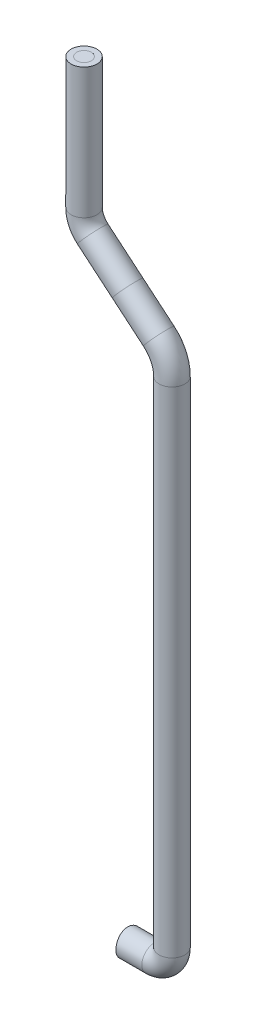
ISO-10303-21;
HEADER;
FILE_DESCRIPTION(('STEP AP214'),'2;1');
FILE_NAME('part.step','',(''),(''),'','','');
FILE_SCHEMA(('AUTOMOTIVE_DESIGN { 1 0 10303 214 1 1 1 1 }'));
ENDSEC;
DATA;
#1=APPLICATION_CONTEXT('core data for automotive mechanical design processes');
#2=APPLICATION_PROTOCOL_DEFINITION('international standard','automotive_design',2000,#1);
#3=PRODUCT_CONTEXT('',#1,'mechanical');
#4=PRODUCT('Part','Part','',(#3));
#5=PRODUCT_RELATED_PRODUCT_CATEGORY('part','',(#4));
#6=PRODUCT_DEFINITION_FORMATION('','',#4);
#7=PRODUCT_DEFINITION_CONTEXT('part definition',#1,'design');
#8=PRODUCT_DEFINITION('design','',#6,#7);
#9=PRODUCT_DEFINITION_SHAPE('','',#8);
#10=(LENGTH_UNIT() NAMED_UNIT(*) SI_UNIT(.MILLI.,.METRE.));
#11=(NAMED_UNIT(*) PLANE_ANGLE_UNIT() SI_UNIT($,.RADIAN.));
#12=(NAMED_UNIT(*) SI_UNIT($,.STERADIAN.) SOLID_ANGLE_UNIT());
#13=UNCERTAINTY_MEASURE_WITH_UNIT(LENGTH_MEASURE(1.E-05),#10,'distance_accuracy_value','');
#14=(GEOMETRIC_REPRESENTATION_CONTEXT(3) GLOBAL_UNCERTAINTY_ASSIGNED_CONTEXT((#13)) GLOBAL_UNIT_ASSIGNED_CONTEXT((#10,
#11,#12)) REPRESENTATION_CONTEXT('',''));
#15=CARTESIAN_POINT('',(0.,0.,0.));
#16=DIRECTION('',(0.,0.,1.));
#17=DIRECTION('',(1.,0.,0.));
#18=AXIS2_PLACEMENT_3D('',#15,#16,#17);
#19=CARTESIAN_POINT('',(-1.4,-1.4,0.));
#20=DIRECTION('',(-1.,0.,0.));
#21=DIRECTION('',(0.,0.,1.));
#22=AXIS2_PLACEMENT_3D('',#19,#20,#21);
#23=CYLINDRICAL_SURFACE('',#22,0.6);
#24=CARTESIAN_POINT('',(-1.4,-1.4,0.));
#25=DIRECTION('',(-1.,0.,0.));
#26=DIRECTION('',(0.,0.,-1.));
#27=AXIS2_PLACEMENT_3D('',#24,#25,#26);
#28=CIRCLE('',#27,0.6);
#29=CARTESIAN_POINT('',(-1.4,-2.,0.));
#30=VERTEX_POINT('',#29);
#31=EDGE_CURVE('E80',#30,#30,#28,.T.);
#32=ORIENTED_EDGE('',*,*,#31,.T.);
#33=EDGE_LOOP('',(#32));
#34=FACE_BOUND('',#33,.T.);
#35=CARTESIAN_POINT('',(-3.6,-2.,0.));
#36=CARTESIAN_POINT('',(-3.59999938603146,-1.99999729292333,-0.0335918457265137));
#37=CARTESIAN_POINT('',(-3.59971478377764,-1.99716856482653,-0.0672119542969745));
#38=CARTESIAN_POINT('',(-3.59860568944523,-1.98591814856572,-0.133551192087413));
#39=CARTESIAN_POINT('',(-3.59778006290974,-1.97748470752623,-0.1662682772259));
#40=CARTESIAN_POINT('',(-3.59568234677437,-1.95527324265569,-0.229786553121766));
#41=CARTESIAN_POINT('',(-3.59441069727381,-1.94150048582344,-0.260589597359059));
#42=CARTESIAN_POINT('',(-3.59156337422976,-1.90901102950739,-0.319432433360506));
#43=CARTESIAN_POINT('',(-3.58998783342366,-1.89029648724535,-0.347473423519698));
#44=CARTESIAN_POINT('',(-3.58670250528,-1.84837889093529,-0.400115063589076));
#45=CARTESIAN_POINT('',(-3.58499229287426,-1.82516125636204,-0.424704078066687));
#46=CARTESIAN_POINT('',(-3.58163382240315,-1.7749266019936,-0.4696445222726));
#47=CARTESIAN_POINT('',(-3.57998557023974,-1.74790922141375,-0.489995549149648));
#48=CARTESIAN_POINT('',(-3.57693354248889,-1.69077275458397,-0.525920460322328));
#49=CARTESIAN_POINT('',(-3.57553028796241,-1.66064726924697,-0.5414842153007));
#50=CARTESIAN_POINT('',(-3.57313221656801,-1.59819436570304,-0.567327921195507));
#51=CARTESIAN_POINT('',(-3.57213738604487,-1.56586702115494,-0.577608048767019));
#52=CARTESIAN_POINT('',(-3.57067250509072,-1.50004294873963,-0.59255941823305));
#53=CARTESIAN_POINT('',(-3.57020070322109,-1.46655051338077,-0.597249383602786));
#54=CARTESIAN_POINT('',(-3.56982985819532,-1.39925074185212,-0.600945172724531));
#55=CARTESIAN_POINT('',(-3.56993080099697,-1.36544341342298,-0.599951135833545));
#56=CARTESIAN_POINT('',(-3.57069243966251,-1.29860296605112,-0.592322585938024));
#57=CARTESIAN_POINT('',(-3.57135110155444,-1.26556748150734,-0.585708568398926));
#58=CARTESIAN_POINT('',(-3.57315079526416,-1.2010775098771,-0.567059594864203));
#59=CARTESIAN_POINT('',(-3.57429183798723,-1.16962305855133,-0.555024516313275));
#60=CARTESIAN_POINT('',(-3.5769301115438,-1.10912259469532,-0.525851938170345));
#61=CARTESIAN_POINT('',(-3.57842798827888,-1.08008107988233,-0.50870517164905));
#62=CARTESIAN_POINT('',(-3.58161044950285,-1.02528273385679,-0.46980418892808));
#63=CARTESIAN_POINT('',(-3.58329502402661,-0.999525727489062,-0.448050218584593));
#64=CARTESIAN_POINT('',(-3.58666992352064,-0.951910269980742,-0.400442064223918));
#65=CARTESIAN_POINT('',(-3.58836024277563,-0.930068720962396,-0.37457097277022));
#66=CARTESIAN_POINT('',(-3.59155027126064,-0.89102580573899,-0.319506886235193));
#67=CARTESIAN_POINT('',(-3.59304989199853,-0.873826589645823,-0.290312360763655));
#68=CARTESIAN_POINT('',(-3.59569027405106,-0.844558520129377,-0.229407979063295));
#69=CARTESIAN_POINT('',(-3.59683067670068,-0.832494790089495,-0.197695648201072));
#70=CARTESIAN_POINT('',(-3.59861914853772,-0.813895006647917,-0.132733635856683));
#71=CARTESIAN_POINT('',(-3.5992682616839,-0.807347228832552,-0.0994873743933924));
#72=CARTESIAN_POINT('',(-3.59987862644742,-0.801212274817143,-0.0440546787228878));
#73=CARTESIAN_POINT('',(-3.60000040271161,-0.799998224385904,-0.0220334190582218));
#74=CARTESIAN_POINT('',(-3.59999938603146,-0.800002707076674,0.0335918457265163));
#75=CARTESIAN_POINT('',(-3.59971478377764,-0.80283143517347,0.067211954296977));
#76=CARTESIAN_POINT('',(-3.59860568944523,-0.814081851434279,0.133551192087416));
#77=CARTESIAN_POINT('',(-3.59778006290974,-0.822515292473775,0.166268277225903));
#78=CARTESIAN_POINT('',(-3.59568234677437,-0.844726757344313,0.229786553121768));
#79=CARTESIAN_POINT('',(-3.59441069727381,-0.85849951417656,0.260589597359061));
#80=CARTESIAN_POINT('',(-3.59156337422976,-0.890988970492611,0.319432433360508));
#81=CARTESIAN_POINT('',(-3.58998783342366,-0.909703512754648,0.3474734235197));
#82=CARTESIAN_POINT('',(-3.58670250528,-0.951621109064715,0.400115063589078));
#83=CARTESIAN_POINT('',(-3.58499229287426,-0.97483874363796,0.424704078066689));
#84=CARTESIAN_POINT('',(-3.58163382240315,-1.02507339800641,0.469644522272602));
#85=CARTESIAN_POINT('',(-3.57998557023974,-1.05209077858625,0.489995549149649));
#86=CARTESIAN_POINT('',(-3.57693354248889,-1.10922724541604,0.52592046032233));
#87=CARTESIAN_POINT('',(-3.57553028796241,-1.13935273075303,0.541484215300701));
#88=CARTESIAN_POINT('',(-3.57313221656801,-1.20180563429697,0.567327921195508));
#89=CARTESIAN_POINT('',(-3.57213738604487,-1.23413297884507,0.57760804876702));
#90=CARTESIAN_POINT('',(-3.57067250509072,-1.29995705126037,0.592559418233051));
#91=CARTESIAN_POINT('',(-3.57020070322109,-1.33344948661923,0.597249383602787));
#92=CARTESIAN_POINT('',(-3.56982985819532,-1.40074925814788,0.600945172724531));
#93=CARTESIAN_POINT('',(-3.56993080099697,-1.43455658657702,0.599951135833545));
#94=CARTESIAN_POINT('',(-3.57069243966251,-1.50139703394888,0.592322585938023));
#95=CARTESIAN_POINT('',(-3.57135110155444,-1.53443251849266,0.585708568398925));
#96=CARTESIAN_POINT('',(-3.57315079526416,-1.5989224901229,0.567059594864202));
#97=CARTESIAN_POINT('',(-3.57429183798723,-1.63037694144867,0.555024516313274));
#98=CARTESIAN_POINT('',(-3.5769301115438,-1.69087740530468,0.525851938170343));
#99=CARTESIAN_POINT('',(-3.57842798827888,-1.71991892011767,0.508705171649048));
#100=CARTESIAN_POINT('',(-3.58161044950285,-1.77471726614321,0.469804188928079));
#101=CARTESIAN_POINT('',(-3.58329502402661,-1.80047427251094,0.448050218584592));
#102=CARTESIAN_POINT('',(-3.58666992352064,-1.84808973001926,0.400442064223916));
#103=CARTESIAN_POINT('',(-3.58836024277563,-1.86993127903761,0.374570972770218));
#104=CARTESIAN_POINT('',(-3.59155027126064,-1.90897419426101,0.31950688623519));
#105=CARTESIAN_POINT('',(-3.59304989199853,-1.92617341035418,0.290312360763652));
#106=CARTESIAN_POINT('',(-3.59569027405106,-1.95544147987062,0.229407979063292));
#107=CARTESIAN_POINT('',(-3.59683067670068,-1.96750520991051,0.197695648201069));
#108=CARTESIAN_POINT('',(-3.59861914853772,-1.98610499335208,0.13273363585668));
#109=CARTESIAN_POINT('',(-3.5992682616839,-1.99265277116745,0.0994873743933895));
#110=CARTESIAN_POINT('',(-3.59987862644742,-1.99878772518286,0.0440546787228867));
#111=CARTESIAN_POINT('',(-3.60000040271161,-2.0000017756141,0.0220334190582226));
#112=CARTESIAN_POINT('',(-3.6,-2.,0.));
#113=B_SPLINE_CURVE_WITH_KNOTS('',3,(#35,#36,#37,#38,#39,#40,#41,#42,#43,#44,#45,#46,#47,#48,
#49,#50,#51,#52,#53,#54,#55,#56,#57,#58,#59,#60,#61,#62,#63,#64,#65,#66,#67,#68,#69,#70,#71,#72,
#73,#74,#75,#76,#77,#78,#79,#80,#81,#82,#83,#84,#85,#86,#87,#88,#89,#90,#91,#92,#93,#94,#95,#96,
#97,#98,#99,#100,#101,#102,#103,#104,#105,#106,#107,#108,#109,#110,#111,#112),.UNSPECIFIED.,.T.,
.F.,(4,2,2,2,2,2,2,2,2,2,2,2,2,2,2,2,2,2,2,2,2,2,2,2,2,2,2,2,2,2,2,2,2,2,2,2,2,2,4),(0.,
0.100705430393277,0.201622705491087,0.302440682440186,0.403214722186349,0.504320675336556,
0.605436234953383,0.706764294654636,0.808088966289427,0.909073302660921,1.01005516316879,
1.11067032651546,1.21128776460886,1.31208873196716,1.4128843215951,1.5141050611402,
1.61537260127478,1.7167409348648,1.81789325775417,1.88394753078694,1.98465296118021,
2.08557023627802,2.18638821322712,2.28716225297329,2.38826820612349,2.48938376574032,
2.59071182544157,2.69203649707636,2.79302083344786,2.89400269395573,2.9946178573024,
3.09523529539579,3.1960362627541,3.29683185238204,3.39805259192713,3.49932013206172,
3.60068846565173,3.70184078854111,3.76789506157387),.UNSPECIFIED.);
#114=CARTESIAN_POINT('',(-3.6,-2.,0.));
#115=VERTEX_POINT('',#114);
#116=EDGE_CURVE('E11',#115,#115,#113,.T.);
#117=ORIENTED_EDGE('',*,*,#116,.T.);
#118=EDGE_LOOP('',(#117));
#119=FACE_BOUND('',#118,.T.);
#120=ADVANCED_FACE('F43',(#34,#119),#23,.T.);
#121=CARTESIAN_POINT('',(-7.15,59.1195496892275,0.));
#122=DIRECTION('',(0.,-1.,0.));
#123=DIRECTION('',(0.,0.,-1.));
#124=AXIS2_PLACEMENT_3D('',#121,#122,#123);
#125=PLANE('',#124);
#126=CARTESIAN_POINT('',(-7.15,59.1195496892275,0.));
#127=DIRECTION('',(0.,-1.,0.));
#128=DIRECTION('',(0.,0.,-1.));
#129=AXIS2_PLACEMENT_3D('',#126,#127,#128);
#130=CIRCLE('',#129,0.6);
#131=CARTESIAN_POINT('',(-7.15,59.1195496892275,-0.6));
#132=VERTEX_POINT('',#131);
#133=EDGE_CURVE('E55',#132,#132,#130,.T.);
#134=ORIENTED_EDGE('',*,*,#133,.F.);
#135=EDGE_LOOP('',(#134));
#136=FACE_BOUND('',#135,.T.);
#137=ADVANCED_FACE('F45',(#136),#125,.F.);
#138=CARTESIAN_POINT('',(0.,0.,0.));
#139=DIRECTION('',(0.,1.,0.));
#140=DIRECTION('',(0.,0.,1.));
#141=AXIS2_PLACEMENT_3D('',#138,#139,#140);
#142=CYLINDRICAL_SURFACE('',#141,0.6);
#143=CARTESIAN_POINT('',(0.,40.180318355535,0.));
#144=DIRECTION('',(0.,-1.,0.));
#145=DIRECTION('',(0.,0.,-1.));
#146=AXIS2_PLACEMENT_3D('',#143,#144,#145);
#147=CIRCLE('',#146,0.6);
#148=CARTESIAN_POINT('',(0.6,40.180318355535,0.));
#149=VERTEX_POINT('',#148);
#150=EDGE_CURVE('E74',#149,#149,#147,.T.);
#151=ORIENTED_EDGE('',*,*,#150,.T.);
#152=EDGE_LOOP('',(#151));
#153=FACE_BOUND('',#152,.T.);
#154=CARTESIAN_POINT('',(0.,0.,0.));
#155=DIRECTION('',(0.,-1.,0.));
#156=DIRECTION('',(0.,0.,-1.));
#157=AXIS2_PLACEMENT_3D('',#154,#155,#156);
#158=CIRCLE('',#157,0.6);
#159=CARTESIAN_POINT('',(0.600000000000001,0.,0.));
#160=VERTEX_POINT('',#159);
#161=EDGE_CURVE('E77',#160,#160,#158,.T.);
#162=ORIENTED_EDGE('',*,*,#161,.F.);
#163=EDGE_LOOP('',(#162));
#164=FACE_BOUND('',#163,.T.);
#165=ADVANCED_FACE('F93',(#153,#164),#142,.T.);
#166=CARTESIAN_POINT('',(-3.,40.180318355535,0.));
#167=DIRECTION('',(0.,0.,1.));
#168=DIRECTION('',(1.,0.,0.));
#169=AXIS2_PLACEMENT_3D('',#166,#167,#168);
#170=TOROIDAL_SURFACE('',#169,3.,0.6);
#171=CARTESIAN_POINT('',(-1.07163717094039,42.4784516848919,0.));
#172=DIRECTION('',(0.766044443118979,-0.642787609686538,0.));
#173=DIRECTION('',(0.,0.,-1.));
#174=AXIS2_PLACEMENT_3D('',#171,#172,#173);
#175=CIRCLE('',#174,0.6);
#176=CARTESIAN_POINT('',(-0.685964605128464,42.9380783507633,0.));
#177=VERTEX_POINT('',#176);
#178=EDGE_CURVE('E71',#177,#177,#175,.T.);
#179=CARTESIAN_POINT('',(-3.,40.180318355535,0.));
#180=DIRECTION('',(0.,0.,1.));
#181=DIRECTION('',(1.,0.,0.));
#182=AXIS2_PLACEMENT_3D('',#179,#180,#181);
#183=CIRCLE('',#182,3.6);
#184=EDGE_CURVE('',#149,#177,#183,.T.);
#185=ORIENTED_EDGE('',*,*,#150,.F.);
#186=ORIENTED_EDGE('',*,*,#178,.T.);
#187=ORIENTED_EDGE('',*,*,#184,.T.);
#188=ORIENTED_EDGE('',*,*,#184,.F.);
#189=EDGE_LOOP('',(#185,#187,#186,#188));
#190=FACE_BOUND('',#189,.T.);
#191=ADVANCED_FACE('F95',(#190),#170,.T.);
#192=CARTESIAN_POINT('',(-1.07163717094039,42.4784516848919,0.));
#193=DIRECTION('',(-0.76604444311898,0.642787609686537,0.));
#194=DIRECTION('',(-0.642787609686537,-0.76604444311898,0.));
#195=AXIS2_PLACEMENT_3D('',#192,#193,#194);
#196=CYLINDRICAL_SURFACE('',#195,0.6);
#197=CARTESIAN_POINT('',(-3.6,44.6000000022382,0.));
#198=DIRECTION('',(0.76604444311898,-0.642787609686537,0.));
#199=DIRECTION('',(0.,0.,-1.));
#200=AXIS2_PLACEMENT_3D('',#197,#198,#199);
#201=CIRCLE('',#200,0.6);
#202=CARTESIAN_POINT('',(-3.6,44.6000000022382,-0.6));
#203=VERTEX_POINT('',#202);
#204=EDGE_CURVE('E68',#203,#203,#201,.T.);
#205=ORIENTED_EDGE('',*,*,#204,.T.);
#206=EDGE_LOOP('',(#205));
#207=FACE_BOUND('',#206,.T.);
#208=ORIENTED_EDGE('',*,*,#178,.F.);
#209=EDGE_LOOP('',(#208));
#210=FACE_BOUND('',#209,.T.);
#211=ADVANCED_FACE('F102',(#207,#210),#196,.T.);
#212=CARTESIAN_POINT('',(-3.6,44.6000000022382,0.));
#213=DIRECTION('',(-0.766044443118978,0.64278760968654,0.));
#214=DIRECTION('',(-0.64278760968654,-0.766044443118978,0.));
#215=AXIS2_PLACEMENT_3D('',#212,#213,#214);
#216=CYLINDRICAL_SURFACE('',#215,0.6);
#217=CARTESIAN_POINT('',(-6.43557521937307,46.9793301229896,0.));
#218=DIRECTION('',(0.766044443118978,-0.642787609686539,0.));
#219=DIRECTION('',(0.,0.,-1.));
#220=AXIS2_PLACEMENT_3D('',#217,#218,#219);
#221=CIRCLE('',#220,0.6);
#222=CARTESIAN_POINT('',(-6.82124778518499,46.5197034571182,0.));
#223=VERTEX_POINT('',#222);
#224=EDGE_CURVE('E63',#223,#223,#221,.T.);
#225=ORIENTED_EDGE('',*,*,#224,.T.);
#226=EDGE_LOOP('',(#225));
#227=FACE_BOUND('',#226,.T.);
#228=ORIENTED_EDGE('',*,*,#204,.F.);
#229=EDGE_LOOP('',(#228));
#230=FACE_BOUND('',#229,.T.);
#231=ADVANCED_FACE('F115',(#227,#230),#216,.T.);
#232=CARTESIAN_POINT('',(-5.15,48.5114190092275,0.));
#233=DIRECTION('',(0.,0.,-1.));
#234=DIRECTION('',(-1.,0.,0.));
#235=AXIS2_PLACEMENT_3D('',#232,#233,#234);
#236=TOROIDAL_SURFACE('',#235,1.99999999999999,0.6);
#237=CARTESIAN_POINT('',(-7.15,48.5114190092275,0.));
#238=DIRECTION('',(0.,-1.,0.));
#239=DIRECTION('',(0.,0.,-1.));
#240=AXIS2_PLACEMENT_3D('',#237,#238,#239);
#241=CIRCLE('',#240,0.6);
#242=CARTESIAN_POINT('',(-7.74999999999999,48.5114190092275,0.));
#243=VERTEX_POINT('',#242);
#244=EDGE_CURVE('E59',#243,#243,#241,.T.);
#245=CARTESIAN_POINT('',(-5.15,48.5114190092275,0.));
#246=DIRECTION('',(0.,0.,-1.));
#247=DIRECTION('',(-1.,0.,0.));
#248=AXIS2_PLACEMENT_3D('',#245,#246,#247);
#249=CIRCLE('',#248,2.59999999999999);
#250=EDGE_CURVE('',#223,#243,#249,.T.);
#251=ORIENTED_EDGE('',*,*,#224,.F.);
#252=ORIENTED_EDGE('',*,*,#244,.T.);
#253=ORIENTED_EDGE('',*,*,#250,.T.);
#254=ORIENTED_EDGE('',*,*,#250,.F.);
#255=EDGE_LOOP('',(#251,#253,#252,#254));
#256=FACE_BOUND('',#255,.T.);
#257=ADVANCED_FACE('F111',(#256),#236,.T.);
#258=CARTESIAN_POINT('',(-7.15,48.5114190092275,0.));
#259=DIRECTION('',(0.,1.,0.));
#260=DIRECTION('',(-1.,0.,0.));
#261=AXIS2_PLACEMENT_3D('',#258,#259,#260);
#262=CYLINDRICAL_SURFACE('',#261,0.6);
#263=ORIENTED_EDGE('',*,*,#133,.T.);
#264=EDGE_LOOP('',(#263));
#265=FACE_BOUND('',#264,.T.);
#266=ORIENTED_EDGE('',*,*,#244,.F.);
#267=EDGE_LOOP('',(#266));
#268=FACE_BOUND('',#267,.T.);
#269=ADVANCED_FACE('F89',(#265,#268),#262,.T.);
#270=CARTESIAN_POINT('',(-1.4,0.,0.));
#271=DIRECTION('',(0.,0.,-1.));
#272=DIRECTION('',(-1.,0.,0.));
#273=AXIS2_PLACEMENT_3D('',#270,#271,#272);
#274=TOROIDAL_SURFACE('',#273,1.4,0.6);
#275=CARTESIAN_POINT('',(-1.4,0.,0.));
#276=DIRECTION('',(0.,0.,-1.));
#277=DIRECTION('',(-1.,0.,0.));
#278=AXIS2_PLACEMENT_3D('',#275,#276,#277);
#279=CIRCLE('',#278,2.);
#280=EDGE_CURVE('',#160,#30,#279,.T.);
#281=ORIENTED_EDGE('',*,*,#161,.T.);
#282=ORIENTED_EDGE('',*,*,#31,.F.);
#283=ORIENTED_EDGE('',*,*,#280,.T.);
#284=ORIENTED_EDGE('',*,*,#280,.F.);
#285=EDGE_LOOP('',(#281,#283,#282,#284));
#286=FACE_BOUND('',#285,.T.);
#287=ADVANCED_FACE('F85',(#286),#274,.T.);
#288=CARTESIAN_POINT('',(2.4,7.55,0.));
#289=DIRECTION('',(0.,-1.,0.));
#290=DIRECTION('',(0.,0.,-1.));
#291=AXIS2_PLACEMENT_3D('',#288,#289,#290);
#292=CYLINDRICAL_SURFACE('',#291,6.);
#293=ORIENTED_EDGE('',*,*,#116,.F.);
#294=EDGE_LOOP('',(#293));
#295=FACE_BOUND('',#294,.T.);
#296=ADVANCED_FACE('F88',(#295),#292,.T.);
#297=CLOSED_SHELL('',(#120,#137,#165,#191,#211,#231,#257,#269,#287,#296));
#298=MANIFOLD_SOLID_BREP('B2',#297);
#299=CARTESIAN_POINT('',(-1.4,-1.4,0.));
#300=DIRECTION('',(-1.,0.,0.));
#301=DIRECTION('',(0.,0.,1.));
#302=AXIS2_PLACEMENT_3D('',#299,#300,#301);
#303=CYLINDRICAL_SURFACE('',#302,1.05);
#304=CARTESIAN_POINT('',(-1.4,-1.4,0.));
#305=DIRECTION('',(-1.,0.,0.));
#306=DIRECTION('',(0.,0.,-1.));
#307=AXIS2_PLACEMENT_3D('',#304,#305,#306);
#308=CIRCLE('',#307,1.05);
#309=CARTESIAN_POINT('',(-1.4,-2.45,0.));
#310=VERTEX_POINT('',#309);
#311=EDGE_CURVE('E253',#310,#310,#308,.T.);
#312=ORIENTED_EDGE('',*,*,#311,.T.);
#313=EDGE_LOOP('',(#312));
#314=FACE_BOUND('',#313,.T.);
#315=CARTESIAN_POINT('',(-3.6,-2.45,0.));
#316=CARTESIAN_POINT('',(-3.59999882654764,-2.44999728144867,-0.0584420204428061));
#317=CARTESIAN_POINT('',(-3.59913650732618,-2.44510000910616,-0.116958132425665));
#318=CARTESIAN_POINT('',(-3.59577722267333,-2.42563787265427,-0.232390779304183));
#319=CARTESIAN_POINT('',(-3.59327695859125,-2.41105349890432,-0.289303844077928));
#320=CARTESIAN_POINT('',(-3.58692199180402,-2.372672010416,-0.39977751157926));
#321=CARTESIAN_POINT('',(-3.58306903010429,-2.34888673381991,-0.453342319817157));
#322=CARTESIAN_POINT('',(-3.57443219380795,-2.29280692209552,-0.555699045634291));
#323=CARTESIAN_POINT('',(-3.5696486570959,-2.26051547398982,-0.604492685953901));
#324=CARTESIAN_POINT('',(-3.55962263242419,-2.18797278745103,-0.696463405273728));
#325=CARTESIAN_POINT('',(-3.55437621501589,-2.14764882283901,-0.739582703296022));
#326=CARTESIAN_POINT('',(-3.54404526339027,-2.06034040782813,-0.818482226810394));
#327=CARTESIAN_POINT('',(-3.53896074840682,-2.01335516966361,-0.854261583050793));
#328=CARTESIAN_POINT('',(-3.52949202998072,-1.91366364465653,-0.917694608774674));
#329=CARTESIAN_POINT('',(-3.52511282919395,-1.86092059142462,-0.945291308382155));
#330=CARTESIAN_POINT('',(-3.51760474008986,-1.75145827462108,-0.991210841917993));
#331=CARTESIAN_POINT('',(-3.51447574761267,-1.69473934275885,-1.0095344484589));
#332=CARTESIAN_POINT('',(-3.50986115542547,-1.57954282817136,-1.03620668485384));
#333=CARTESIAN_POINT('',(-3.5083592501825,-1.52108884235882,-1.04465435357991));
#334=CARTESIAN_POINT('',(-3.50711962872806,-1.40357521569552,-1.05164211226404));
#335=CARTESIAN_POINT('',(-3.50738177772354,-1.34451562146419,-1.05018295921163));
#336=CARTESIAN_POINT('',(-3.50962576963407,-1.22817892307428,-1.03747905088222));
#337=CARTESIAN_POINT('',(-3.51158795307566,-1.17088916864427,-1.02634615998595));
#338=CARTESIAN_POINT('',(-3.51698013671817,-1.05900290273248,-0.994786430854397));
#339=CARTESIAN_POINT('',(-3.5204102037736,-1.00440651404589,-0.974359169305901));
#340=CARTESIAN_POINT('',(-3.528372773444,-0.899123656399449,-0.924677939988589));
#341=CARTESIAN_POINT('',(-3.53291102606906,-0.848459458162703,-0.895377736596717));
#342=CARTESIAN_POINT('',(-3.54257425888112,-0.752728317622276,-0.828817510782036));
#343=CARTESIAN_POINT('',(-3.54769924636775,-0.707661444970163,-0.791557389323903));
#344=CARTESIAN_POINT('',(-3.55804394565978,-0.623760548003456,-0.709535297831806));
#345=CARTESIAN_POINT('',(-3.56326400197189,-0.585018921961037,-0.66467880741791));
#346=CARTESIAN_POINT('',(-3.57314929955695,-0.51558044588738,-0.569030028255325));
#347=CARTESIAN_POINT('',(-3.57781429323867,-0.484887178613202,-0.518235110491179));
#348=CARTESIAN_POINT('',(-3.58607198078178,-0.432408705294869,-0.412047228325481));
#349=CARTESIAN_POINT('',(-3.58966274845476,-0.410639475324484,-0.356646229329764));
#350=CARTESIAN_POINT('',(-3.59534708225393,-0.376784906318021,-0.242969833236208));
#351=CARTESIAN_POINT('',(-3.59744380052951,-0.364679172679017,-0.184700766731596));
#352=CARTESIAN_POINT('',(-3.5991178906655,-0.355050834919473,-0.105003930626633));
#353=CARTESIAN_POINT('',(-3.59944796804276,-0.353158320413336,-0.0840519549830512));
#354=CARTESIAN_POINT('',(-3.59988923404206,-0.35063241299874,-0.0420698538801488));
#355=CARTESIAN_POINT('',(-3.60000042245492,-0.349999021293564,-0.0210397283461636));
#356=CARTESIAN_POINT('',(-3.59999882654764,-0.350002718551328,0.0584420204428084));
#357=CARTESIAN_POINT('',(-3.59913650732618,-0.354899990893835,0.116958132425667));
#358=CARTESIAN_POINT('',(-3.59577722267333,-0.374362127345728,0.232390779304185));
#359=CARTESIAN_POINT('',(-3.59327695859125,-0.388946501095684,0.28930384407793));
#360=CARTESIAN_POINT('',(-3.58692199180402,-0.427327989583997,0.399777511579263));
#361=CARTESIAN_POINT('',(-3.58306903010429,-0.451113266180095,0.45334231981716));
#362=CARTESIAN_POINT('',(-3.57443219380795,-0.50719307790448,0.555699045634293));
#363=CARTESIAN_POINT('',(-3.5696486570959,-0.53948452601018,0.604492685953903));
#364=CARTESIAN_POINT('',(-3.55962263242419,-0.612027212548971,0.69646340527373));
#365=CARTESIAN_POINT('',(-3.5543762150159,-0.652351177160994,0.739582703296024));
#366=CARTESIAN_POINT('',(-3.54404526339027,-0.739659592171875,0.818482226810397));
#367=CARTESIAN_POINT('',(-3.53896074840682,-0.786644830336395,0.854261583050795));
#368=CARTESIAN_POINT('',(-3.52949202998072,-0.886336355343475,0.917694608774675));
#369=CARTESIAN_POINT('',(-3.52511282919395,-0.93907940857538,0.945291308382156));
#370=CARTESIAN_POINT('',(-3.51760474008987,-1.04854172537893,0.991210841917993));
#371=CARTESIAN_POINT('',(-3.51447574761267,-1.10526065724115,1.0095344484589));
#372=CARTESIAN_POINT('',(-3.50986115542547,-1.22045717182864,1.03620668485384));
#373=CARTESIAN_POINT('',(-3.5083592501825,-1.27891115764118,1.04465435357991));
#374=CARTESIAN_POINT('',(-3.50711962872806,-1.39642478430449,1.05164211226404));
#375=CARTESIAN_POINT('',(-3.50738177772354,-1.45548437853582,1.05018295921163));
#376=CARTESIAN_POINT('',(-3.50962576963407,-1.57182107692573,1.03747905088222));
#377=CARTESIAN_POINT('',(-3.51158795307566,-1.62911083135573,1.02634615998595));
#378=CARTESIAN_POINT('',(-3.51698013671817,-1.74099709726753,0.994786430854397));
#379=CARTESIAN_POINT('',(-3.5204102037736,-1.79559348595411,0.9743591693059));
#380=CARTESIAN_POINT('',(-3.528372773444,-1.90087634360055,0.924677939988588));
#381=CARTESIAN_POINT('',(-3.53291102606906,-1.9515405418373,0.895377736596715));
#382=CARTESIAN_POINT('',(-3.54257425888112,-2.04727168237773,0.828817510782034));
#383=CARTESIAN_POINT('',(-3.54769924636775,-2.09233855502984,0.791557389323901));
#384=CARTESIAN_POINT('',(-3.55804394565978,-2.17623945199655,0.709535297831804));
#385=CARTESIAN_POINT('',(-3.56326400197189,-2.21498107803897,0.664678807417908));
#386=CARTESIAN_POINT('',(-3.57314929955695,-2.28441955411262,0.569030028255322));
#387=CARTESIAN_POINT('',(-3.57781429323867,-2.3151128213868,0.518235110491175));
#388=CARTESIAN_POINT('',(-3.58607198078178,-2.36759129470513,0.412047228325477));
#389=CARTESIAN_POINT('',(-3.58966274845476,-2.38936052467552,0.35664622932976));
#390=CARTESIAN_POINT('',(-3.59534708225394,-2.42321509368198,0.242969833236204));
#391=CARTESIAN_POINT('',(-3.59744380052951,-2.43532082732098,0.184700766731593));
#392=CARTESIAN_POINT('',(-3.5991178906655,-2.44494916508053,0.105003930626631));
#393=CARTESIAN_POINT('',(-3.59944796804276,-2.44684167958666,0.0840519549830497));
#394=CARTESIAN_POINT('',(-3.59988923404206,-2.44936758700126,0.0420698538801492));
#395=CARTESIAN_POINT('',(-3.60000042245492,-2.45000097870644,0.0210397283461651));
#396=CARTESIAN_POINT('',(-3.6,-2.45,0.));
#397=B_SPLINE_CURVE_WITH_KNOTS('',3,(#315,#316,#317,#318,#319,#320,#321,#322,#323,#324,#325,
#326,#327,#328,#329,#330,#331,#332,#333,#334,#335,#336,#337,#338,#339,#340,#341,#342,#343,#344,
#345,#346,#347,#348,#349,#350,#351,#352,#353,#354,#355,#356,#357,#358,#359,#360,#361,#362,#363,
#364,#365,#366,#367,#368,#369,#370,#371,#372,#373,#374,#375,#376,#377,#378,#379,#380,#381,#382,
#383,#384,#385,#386,#387,#388,#389,#390,#391,#392,#393,#394,#395,#396),.UNSPECIFIED.,.T.,.F.,(4,
2,2,2,2,2,2,2,2,2,2,2,2,2,2,2,2,2,2,2,2,2,2,2,2,2,2,2,2,2,2,2,2,2,2,2,2,2,2,2,4),(0.,
0.175245722203911,0.350845460530019,0.526220014716118,0.701531010212524,0.878507996493276,
1.05550592964953,1.23370869761883,1.41189661570247,1.5882818526004,1.76465361188897,
1.93901259767118,2.11337952544915,2.28867116259157,2.46396498079603,2.64162623925306,
2.81936645053747,2.99742348242234,3.17510372779785,3.23819392963313,3.30128419176064,
3.47652991396455,3.65212965229066,3.82750420647676,4.00281520197316,4.17979218825391,
4.35679012141016,4.53499288937946,4.7131808074631,4.88956604436104,5.06593780364961,
5.24029678943182,5.41466371720979,5.5899553543522,5.76524917255667,5.94291043101369,
6.12065064229811,6.29870767418297,6.47638791955849,6.53947812139376,6.60256838352127),.UNSPECIFIED.);
#398=CARTESIAN_POINT('',(-3.6,-2.45,0.));
#399=VERTEX_POINT('',#398);
#400=EDGE_CURVE('E257',#399,#399,#397,.T.);
#401=ORIENTED_EDGE('',*,*,#400,.T.);
#402=EDGE_LOOP('',(#401));
#403=FACE_BOUND('',#402,.T.);
#404=ADVANCED_FACE('F197',(#314,#403),#303,.T.);
#405=CARTESIAN_POINT('',(-1.4,-1.4,0.));
#406=DIRECTION('',(-1.,0.,0.));
#407=DIRECTION('',(0.,0.,1.));
#408=AXIS2_PLACEMENT_3D('',#405,#406,#407);
#409=CYLINDRICAL_SURFACE('',#408,0.6);
#410=CARTESIAN_POINT('',(-1.4,-1.4,0.));
#411=DIRECTION('',(-1.,0.,0.));
#412=DIRECTION('',(0.,0.,-1.));
#413=AXIS2_PLACEMENT_3D('',#410,#411,#412);
#414=CIRCLE('',#413,0.6);
#415=CARTESIAN_POINT('',(-1.4,-2.,0.));
#416=VERTEX_POINT('',#415);
#417=EDGE_CURVE('E252',#416,#416,#414,.F.);
#418=ORIENTED_EDGE('',*,*,#417,.T.);
#419=EDGE_LOOP('',(#418));
#420=FACE_BOUND('',#419,.T.);
#421=CARTESIAN_POINT('',(-3.6,-0.8,0.));
#422=CARTESIAN_POINT('',(-3.59999938603146,-0.800002707076674,-0.0335918457265137));
#423=CARTESIAN_POINT('',(-3.59971478377764,-0.80283143517347,-0.0672119542969744));
#424=CARTESIAN_POINT('',(-3.59860568944523,-0.814081851434279,-0.133551192087413));
#425=CARTESIAN_POINT('',(-3.59778006290974,-0.822515292473775,-0.1662682772259));
#426=CARTESIAN_POINT('',(-3.59568234677437,-0.844726757344312,-0.229786553121766));
#427=CARTESIAN_POINT('',(-3.59441069727381,-0.858499514176559,-0.260589597359059));
#428=CARTESIAN_POINT('',(-3.59156337422976,-0.89098897049261,-0.319432433360505));
#429=CARTESIAN_POINT('',(-3.58998783342366,-0.909703512754647,-0.347473423519698));
#430=CARTESIAN_POINT('',(-3.58670250528,-0.951621109064713,-0.400115063589075));
#431=CARTESIAN_POINT('',(-3.58499229287426,-0.974838743637958,-0.424704078066687));
#432=CARTESIAN_POINT('',(-3.58163382240315,-1.0250733980064,-0.4696445222726));
#433=CARTESIAN_POINT('',(-3.57998557023974,-1.05209077858625,-0.489995549149647));
#434=CARTESIAN_POINT('',(-3.57693354248889,-1.10922724541604,-0.525920460322328));
#435=CARTESIAN_POINT('',(-3.57553028796241,-1.13935273075303,-0.541484215300699));
#436=CARTESIAN_POINT('',(-3.57313221656801,-1.20180563429696,-0.567327921195506));
#437=CARTESIAN_POINT('',(-3.57213738604487,-1.23413297884506,-0.577608048767019));
#438=CARTESIAN_POINT('',(-3.57067250509072,-1.29995705126037,-0.59255941823305));
#439=CARTESIAN_POINT('',(-3.57020070322109,-1.33344948661923,-0.597249383602786));
#440=CARTESIAN_POINT('',(-3.56982985819532,-1.40074925814788,-0.60094517272453));
#441=CARTESIAN_POINT('',(-3.56993080099697,-1.43455658657702,-0.599951135833545));
#442=CARTESIAN_POINT('',(-3.57069243966251,-1.50139703394888,-0.592322585938023));
#443=CARTESIAN_POINT('',(-3.57135110155444,-1.53443251849266,-0.585708568398925));
#444=CARTESIAN_POINT('',(-3.57315079526416,-1.5989224901229,-0.567059594864202));
#445=CARTESIAN_POINT('',(-3.57429183798723,-1.63037694144867,-0.555024516313274));
#446=CARTESIAN_POINT('',(-3.5769301115438,-1.69087740530468,-0.525851938170344));
#447=CARTESIAN_POINT('',(-3.57842798827888,-1.71991892011767,-0.508705171649049));
#448=CARTESIAN_POINT('',(-3.58161044950285,-1.77471726614321,-0.46980418892808));
#449=CARTESIAN_POINT('',(-3.58329502402661,-1.80047427251094,-0.448050218584593));
#450=CARTESIAN_POINT('',(-3.58666992352064,-1.84808973001926,-0.400442064223918));
#451=CARTESIAN_POINT('',(-3.58836024277563,-1.8699312790376,-0.37457097277022));
#452=CARTESIAN_POINT('',(-3.59155027126064,-1.90897419426101,-0.319506886235192));
#453=CARTESIAN_POINT('',(-3.59304989199853,-1.92617341035418,-0.290312360763654));
#454=CARTESIAN_POINT('',(-3.59569027405106,-1.95544147987062,-0.229407979063295));
#455=CARTESIAN_POINT('',(-3.59683067670068,-1.96750520991051,-0.197695648201071));
#456=CARTESIAN_POINT('',(-3.59861914853772,-1.98610499335208,-0.132733635856683));
#457=CARTESIAN_POINT('',(-3.5992682616839,-1.99265277116745,-0.0994873743933924));
#458=CARTESIAN_POINT('',(-3.59987862644742,-1.99878772518286,-0.0440546787228879));
#459=CARTESIAN_POINT('',(-3.60000040271161,-2.0000017756141,-0.0220334190582219));
#460=CARTESIAN_POINT('',(-3.59999938603146,-1.99999729292333,0.0335918457265163));
#461=CARTESIAN_POINT('',(-3.59971478377764,-1.99716856482653,0.067211954296977));
#462=CARTESIAN_POINT('',(-3.59860568944523,-1.98591814856572,0.133551192087416));
#463=CARTESIAN_POINT('',(-3.59778006290974,-1.97748470752622,0.166268277225903));
#464=CARTESIAN_POINT('',(-3.59568234677437,-1.95527324265569,0.229786553121768));
#465=CARTESIAN_POINT('',(-3.59441069727381,-1.94150048582344,0.260589597359061));
#466=CARTESIAN_POINT('',(-3.59156337422976,-1.90901102950739,0.319432433360508));
#467=CARTESIAN_POINT('',(-3.58998783342366,-1.89029648724535,0.3474734235197));
#468=CARTESIAN_POINT('',(-3.58670250528,-1.84837889093528,0.400115063589078));
#469=CARTESIAN_POINT('',(-3.58499229287426,-1.82516125636204,0.424704078066689));
#470=CARTESIAN_POINT('',(-3.58163382240315,-1.77492660199359,0.469644522272601));
#471=CARTESIAN_POINT('',(-3.57998557023974,-1.74790922141375,0.489995549149649));
#472=CARTESIAN_POINT('',(-3.57693354248889,-1.69077275458396,0.525920460322329));
#473=CARTESIAN_POINT('',(-3.57553028796241,-1.66064726924697,0.5414842153007));
#474=CARTESIAN_POINT('',(-3.57313221656801,-1.59819436570303,0.567327921195507));
#475=CARTESIAN_POINT('',(-3.57213738604487,-1.56586702115494,0.57760804876702));
#476=CARTESIAN_POINT('',(-3.57067250509072,-1.50004294873963,0.59255941823305));
#477=CARTESIAN_POINT('',(-3.57020070322109,-1.46655051338077,0.597249383602786));
#478=CARTESIAN_POINT('',(-3.56982985819532,-1.39925074185212,0.60094517272453));
#479=CARTESIAN_POINT('',(-3.56993080099697,-1.36544341342298,0.599951135833544));
#480=CARTESIAN_POINT('',(-3.57069243966251,-1.29860296605112,0.592322585938023));
#481=CARTESIAN_POINT('',(-3.57135110155444,-1.26556748150734,0.585708568398924));
#482=CARTESIAN_POINT('',(-3.57315079526416,-1.2010775098771,0.567059594864201));
#483=CARTESIAN_POINT('',(-3.57429183798723,-1.16962305855133,0.555024516313273));
#484=CARTESIAN_POINT('',(-3.5769301115438,-1.10912259469532,0.525851938170343));
#485=CARTESIAN_POINT('',(-3.57842798827888,-1.08008107988233,0.508705171649048));
#486=CARTESIAN_POINT('',(-3.58161044950285,-1.02528273385679,0.469804188928078));
#487=CARTESIAN_POINT('',(-3.58329502402661,-0.99952572748906,0.448050218584591));
#488=CARTESIAN_POINT('',(-3.58666992352064,-0.95191026998074,0.400442064223916));
#489=CARTESIAN_POINT('',(-3.58836024277563,-0.930068720962395,0.374570972770218));
#490=CARTESIAN_POINT('',(-3.59155027126064,-0.891025805738989,0.31950688623519));
#491=CARTESIAN_POINT('',(-3.59304989199853,-0.873826589645822,0.290312360763652));
#492=CARTESIAN_POINT('',(-3.59569027405106,-0.844558520129376,0.229407979063292));
#493=CARTESIAN_POINT('',(-3.59683067670068,-0.832494790089495,0.197695648201068));
#494=CARTESIAN_POINT('',(-3.59861914853772,-0.813895006647917,0.13273363585668));
#495=CARTESIAN_POINT('',(-3.5992682616839,-0.807347228832552,0.0994873743933892));
#496=CARTESIAN_POINT('',(-3.59987862644742,-0.801212274817144,0.0440546787228866));
#497=CARTESIAN_POINT('',(-3.60000040271161,-0.799998224385904,0.0220334190582225));
#498=CARTESIAN_POINT('',(-3.6,-0.8,0.));
#499=B_SPLINE_CURVE_WITH_KNOTS('',3,(#421,#422,#423,#424,#425,#426,#427,#428,#429,#430,#431,
#432,#433,#434,#435,#436,#437,#438,#439,#440,#441,#442,#443,#444,#445,#446,#447,#448,#449,#450,
#451,#452,#453,#454,#455,#456,#457,#458,#459,#460,#461,#462,#463,#464,#465,#466,#467,#468,#469,
#470,#471,#472,#473,#474,#475,#476,#477,#478,#479,#480,#481,#482,#483,#484,#485,#486,#487,#488,
#489,#490,#491,#492,#493,#494,#495,#496,#497,#498),.UNSPECIFIED.,.T.,.F.,(4,2,2,2,2,2,2,2,2,2,2,
2,2,2,2,2,2,2,2,2,2,2,2,2,2,2,2,2,2,2,2,2,2,2,2,2,2,2,4),(0.,0.100705430393277,
0.201622705491087,0.302440682440186,0.403214722186349,0.504320675336556,0.605436234953383,
0.706764294654636,0.808088966289427,0.90907330266092,1.01005516316879,1.11067032651546,
1.21128776460885,1.31208873196716,1.4128843215951,1.51410506114019,1.61537260127478,
1.7167409348648,1.81789325775417,1.88394753078694,1.98465296118021,2.08557023627802,
2.18638821322712,2.28716225297328,2.38826820612349,2.48938376574032,2.59071182544157,
2.69203649707636,2.79302083344786,2.89400269395572,2.9946178573024,3.09523529539579,
3.1960362627541,3.29683185238204,3.39805259192713,3.49932013206171,3.60068846565173,
3.70184078854111,3.76789506157387),.UNSPECIFIED.);
#500=CARTESIAN_POINT('',(-3.6,-0.8,0.));
#501=VERTEX_POINT('',#500);
#502=EDGE_CURVE('E42',#501,#501,#499,.T.);
#503=ORIENTED_EDGE('',*,*,#502,.T.);
#504=EDGE_LOOP('',(#503));
#505=FACE_BOUND('',#504,.T.);
#506=ADVANCED_FACE('F281',(#420,#505),#409,.F.);
#507=CARTESIAN_POINT('',(-7.15,59.1195496892275,0.));
#508=DIRECTION('',(0.,1.,0.));
#509=DIRECTION('',(0.,0.,1.));
#510=AXIS2_PLACEMENT_3D('',#507,#508,#509);
#511=PLANE('',#510);
#512=CARTESIAN_POINT('',(-7.15,59.1195496892275,0.));
#513=DIRECTION('',(0.,1.,0.));
#514=DIRECTION('',(0.,0.,1.));
#515=AXIS2_PLACEMENT_3D('',#512,#513,#514);
#516=CIRCLE('',#515,0.6);
#517=CARTESIAN_POINT('',(-7.15,59.1195496892275,0.6));
#518=VERTEX_POINT('',#517);
#519=EDGE_CURVE('E231',#518,#518,#516,.T.);
#520=ORIENTED_EDGE('',*,*,#519,.F.);
#521=EDGE_LOOP('',(#520));
#522=FACE_BOUND('',#521,.T.);
#523=CARTESIAN_POINT('',(-7.15,59.1195496892275,0.));
#524=DIRECTION('',(0.,1.,0.));
#525=DIRECTION('',(0.,0.,1.));
#526=AXIS2_PLACEMENT_3D('',#523,#524,#525);
#527=CIRCLE('',#526,1.05);
#528=CARTESIAN_POINT('',(-7.15,59.1195496892275,1.05));
#529=VERTEX_POINT('',#528);
#530=EDGE_CURVE('E209',#529,#529,#527,.T.);
#531=ORIENTED_EDGE('',*,*,#530,.T.);
#532=EDGE_LOOP('',(#531));
#533=FACE_BOUND('',#532,.T.);
#534=ADVANCED_FACE('F199',(#522,#533),#511,.T.);
#535=CARTESIAN_POINT('',(0.,0.,0.));
#536=DIRECTION('',(0.,1.,0.));
#537=DIRECTION('',(0.,0.,1.));
#538=AXIS2_PLACEMENT_3D('',#535,#536,#537);
#539=CYLINDRICAL_SURFACE('',#538,1.05);
#540=CARTESIAN_POINT('',(0.,40.180318355535,0.));
#541=DIRECTION('',(0.,1.,0.));
#542=DIRECTION('',(0.,0.,1.));
#543=AXIS2_PLACEMENT_3D('',#540,#541,#542);
#544=CIRCLE('',#543,1.05);
#545=CARTESIAN_POINT('',(1.05,40.180318355535,0.));
#546=VERTEX_POINT('',#545);
#547=EDGE_CURVE('E228',#546,#546,#544,.T.);
#548=ORIENTED_EDGE('',*,*,#547,.F.);
#549=EDGE_LOOP('',(#548));
#550=FACE_BOUND('',#549,.T.);
#551=CARTESIAN_POINT('',(0.,0.,0.));
#552=DIRECTION('',(0.,-1.,0.));
#553=DIRECTION('',(0.,0.,-1.));
#554=AXIS2_PLACEMENT_3D('',#551,#552,#553);
#555=CIRCLE('',#554,1.05);
#556=CARTESIAN_POINT('',(1.05,0.,0.));
#557=VERTEX_POINT('',#556);
#558=EDGE_CURVE('E256',#557,#557,#555,.T.);
#559=ORIENTED_EDGE('',*,*,#558,.F.);
#560=EDGE_LOOP('',(#559));
#561=FACE_BOUND('',#560,.T.);
#562=ADVANCED_FACE('F316',(#550,#561),#539,.T.);
#563=CARTESIAN_POINT('',(-3.,40.180318355535,0.));
#564=DIRECTION('',(0.,0.,1.));
#565=DIRECTION('',(1.,0.,0.));
#566=AXIS2_PLACEMENT_3D('',#563,#564,#565);
#567=TOROIDAL_SURFACE('',#566,3.,1.05);
#568=CARTESIAN_POINT('',(-1.07163717094039,42.4784516848919,0.));
#569=DIRECTION('',(-0.766044443118979,0.642787609686538,0.));
#570=DIRECTION('',(0.,0.,1.));
#571=AXIS2_PLACEMENT_3D('',#568,#569,#570);
#572=CIRCLE('',#571,1.05);
#573=CARTESIAN_POINT('',(-0.396710180769522,43.2827983501669,0.));
#574=VERTEX_POINT('',#573);
#575=EDGE_CURVE('E225',#574,#574,#572,.T.);
#576=CARTESIAN_POINT('',(-3.,40.180318355535,0.));
#577=DIRECTION('',(0.,0.,1.));
#578=DIRECTION('',(1.,0.,0.));
#579=AXIS2_PLACEMENT_3D('',#576,#577,#578);
#580=CIRCLE('',#579,4.05);
#581=EDGE_CURVE('',#546,#574,#580,.T.);
#582=ORIENTED_EDGE('',*,*,#547,.T.);
#583=ORIENTED_EDGE('',*,*,#575,.F.);
#584=ORIENTED_EDGE('',*,*,#581,.T.);
#585=ORIENTED_EDGE('',*,*,#581,.F.);
#586=EDGE_LOOP('',(#582,#584,#583,#585));
#587=FACE_BOUND('',#586,.T.);
#588=ADVANCED_FACE('F325',(#587),#567,.T.);
#589=CARTESIAN_POINT('',(-1.07163717094039,42.4784516848919,0.));
#590=DIRECTION('',(-0.76604444311898,0.642787609686537,0.));
#591=DIRECTION('',(-0.642787609686537,-0.76604444311898,0.));
#592=AXIS2_PLACEMENT_3D('',#589,#590,#591);
#593=CYLINDRICAL_SURFACE('',#592,1.05);
#594=CARTESIAN_POINT('',(-3.6,44.6000000022382,0.));
#595=DIRECTION('',(-0.76604444311898,0.642787609686537,0.));
#596=DIRECTION('',(0.,0.,1.));
#597=AXIS2_PLACEMENT_3D('',#594,#595,#596);
#598=CIRCLE('',#597,1.05);
#599=CARTESIAN_POINT('',(-3.6,44.6000000022382,1.05));
#600=VERTEX_POINT('',#599);
#601=EDGE_CURVE('E222',#600,#600,#598,.T.);
#602=ORIENTED_EDGE('',*,*,#601,.F.);
#603=EDGE_LOOP('',(#602));
#604=FACE_BOUND('',#603,.T.);
#605=ORIENTED_EDGE('',*,*,#575,.T.);
#606=EDGE_LOOP('',(#605));
#607=FACE_BOUND('',#606,.T.);
#608=ADVANCED_FACE('F333',(#604,#607),#593,.T.);
#609=CARTESIAN_POINT('',(-3.6,44.6000000022382,0.));
#610=DIRECTION('',(-0.766044443118978,0.64278760968654,0.));
#611=DIRECTION('',(-0.64278760968654,-0.766044443118978,0.));
#612=AXIS2_PLACEMENT_3D('',#609,#610,#611);
#613=CYLINDRICAL_SURFACE('',#612,1.05);
#614=CARTESIAN_POINT('',(-6.43557521937307,46.9793301229896,0.));
#615=DIRECTION('',(-0.766044443118978,0.642787609686539,0.));
#616=DIRECTION('',(0.,0.,1.));
#617=AXIS2_PLACEMENT_3D('',#614,#615,#616);
#618=CIRCLE('',#617,1.05);
#619=CARTESIAN_POINT('',(-7.11050220954394,46.1749834577146,0.));
#620=VERTEX_POINT('',#619);
#621=EDGE_CURVE('E217',#620,#620,#618,.T.);
#622=ORIENTED_EDGE('',*,*,#621,.F.);
#623=EDGE_LOOP('',(#622));
#624=FACE_BOUND('',#623,.T.);
#625=ORIENTED_EDGE('',*,*,#601,.T.);
#626=EDGE_LOOP('',(#625));
#627=FACE_BOUND('',#626,.T.);
#628=ADVANCED_FACE('F341',(#624,#627),#613,.T.);
#629=CARTESIAN_POINT('',(-5.15,48.5114190092275,0.));
#630=DIRECTION('',(0.,0.,-1.));
#631=DIRECTION('',(-1.,0.,0.));
#632=AXIS2_PLACEMENT_3D('',#629,#630,#631);
#633=TOROIDAL_SURFACE('',#632,1.99999999999999,1.05);
#634=CARTESIAN_POINT('',(-7.15,48.5114190092275,0.));
#635=DIRECTION('',(0.,1.,0.));
#636=DIRECTION('',(0.,0.,1.));
#637=AXIS2_PLACEMENT_3D('',#634,#635,#636);
#638=CIRCLE('',#637,1.05);
#639=CARTESIAN_POINT('',(-8.19999999999999,48.5114190092275,0.));
#640=VERTEX_POINT('',#639);
#641=EDGE_CURVE('E213',#640,#640,#638,.T.);
#642=CARTESIAN_POINT('',(-5.15,48.5114190092275,0.));
#643=DIRECTION('',(0.,0.,-1.));
#644=DIRECTION('',(-1.,0.,0.));
#645=AXIS2_PLACEMENT_3D('',#642,#643,#644);
#646=CIRCLE('',#645,3.04999999999999);
#647=EDGE_CURVE('',#620,#640,#646,.T.);
#648=ORIENTED_EDGE('',*,*,#621,.T.);
#649=ORIENTED_EDGE('',*,*,#641,.F.);
#650=ORIENTED_EDGE('',*,*,#647,.T.);
#651=ORIENTED_EDGE('',*,*,#647,.F.);
#652=EDGE_LOOP('',(#648,#650,#649,#651));
#653=FACE_BOUND('',#652,.T.);
#654=ADVANCED_FACE('F349',(#653),#633,.T.);
#655=CARTESIAN_POINT('',(-7.15,48.5114190092275,0.));
#656=DIRECTION('',(0.,1.,0.));
#657=DIRECTION('',(-1.,0.,0.));
#658=AXIS2_PLACEMENT_3D('',#655,#656,#657);
#659=CYLINDRICAL_SURFACE('',#658,1.05);
#660=ORIENTED_EDGE('',*,*,#530,.F.);
#661=EDGE_LOOP('',(#660));
#662=FACE_BOUND('',#661,.T.);
#663=ORIENTED_EDGE('',*,*,#641,.T.);
#664=EDGE_LOOP('',(#663));
#665=FACE_BOUND('',#664,.T.);
#666=ADVANCED_FACE('F285',(#662,#665),#659,.T.);
#667=CARTESIAN_POINT('',(-7.15,48.5114190092275,0.));
#668=DIRECTION('',(0.,1.,0.));
#669=DIRECTION('',(-1.,0.,0.));
#670=AXIS2_PLACEMENT_3D('',#667,#668,#669);
#671=CYLINDRICAL_SURFACE('',#670,0.6);
#672=CARTESIAN_POINT('',(-7.15,48.5114190092275,0.));
#673=DIRECTION('',(0.,-1.,0.));
#674=DIRECTION('',(0.,0.,-1.));
#675=AXIS2_PLACEMENT_3D('',#672,#673,#674);
#676=CIRCLE('',#675,0.6);
#677=CARTESIAN_POINT('',(-7.74999999999999,48.5114190092275,0.));
#678=VERTEX_POINT('',#677);
#679=EDGE_CURVE('E234',#678,#678,#676,.T.);
#680=ORIENTED_EDGE('',*,*,#679,.T.);
#681=EDGE_LOOP('',(#680));
#682=FACE_BOUND('',#681,.T.);
#683=ORIENTED_EDGE('',*,*,#519,.T.);
#684=EDGE_LOOP('',(#683));
#685=FACE_BOUND('',#684,.T.);
#686=ADVANCED_FACE('F294',(#682,#685),#671,.F.);
#687=CARTESIAN_POINT('',(0.,-4.,0.));
#688=DIRECTION('',(0.,1.,0.));
#689=DIRECTION('',(0.,0.,1.));
#690=AXIS2_PLACEMENT_3D('',#687,#688,#689);
#691=CYLINDRICAL_SURFACE('',#690,0.6);
#692=CARTESIAN_POINT('',(0.,0.,0.));
#693=DIRECTION('',(0.,1.,0.));
#694=DIRECTION('',(0.,0.,1.));
#695=AXIS2_PLACEMENT_3D('',#692,#693,#694);
#696=CIRCLE('',#695,0.6);
#697=CARTESIAN_POINT('',(0.6,0.,0.));
#698=VERTEX_POINT('',#697);
#699=EDGE_CURVE('E239',#698,#698,#696,.T.);
#700=ORIENTED_EDGE('',*,*,#699,.F.);
#701=EDGE_LOOP('',(#700));
#702=FACE_BOUND('',#701,.T.);
#703=CARTESIAN_POINT('',(0.,40.180318355535,0.));
#704=DIRECTION('',(0.,-1.,0.));
#705=DIRECTION('',(0.,0.,-1.));
#706=AXIS2_PLACEMENT_3D('',#703,#704,#705);
#707=CIRCLE('',#706,0.6);
#708=CARTESIAN_POINT('',(0.6,40.180318355535,0.));
#709=VERTEX_POINT('',#708);
#710=EDGE_CURVE('E235',#709,#709,#707,.T.);
#711=ORIENTED_EDGE('',*,*,#710,.F.);
#712=EDGE_LOOP('',(#711));
#713=FACE_BOUND('',#712,.T.);
#714=ADVANCED_FACE('F280',(#702,#713),#691,.F.);
#715=CARTESIAN_POINT('',(-3.,40.180318355535,0.));
#716=DIRECTION('',(0.,0.,1.));
#717=DIRECTION('',(1.,0.,0.));
#718=AXIS2_PLACEMENT_3D('',#715,#716,#717);
#719=TOROIDAL_SURFACE('',#718,3.,0.6);
#720=CARTESIAN_POINT('',(-1.07163717094039,42.4784516848919,0.));
#721=DIRECTION('',(0.766044443118979,-0.642787609686538,0.));
#722=DIRECTION('',(0.,0.,-1.));
#723=AXIS2_PLACEMENT_3D('',#720,#721,#722);
#724=CIRCLE('',#723,0.6);
#725=CARTESIAN_POINT('',(-0.685964605128464,42.9380783507633,0.));
#726=VERTEX_POINT('',#725);
#727=EDGE_CURVE('E238',#726,#726,#724,.T.);
#728=CARTESIAN_POINT('',(-3.,40.180318355535,0.));
#729=DIRECTION('',(0.,0.,1.));
#730=DIRECTION('',(1.,0.,0.));
#731=AXIS2_PLACEMENT_3D('',#728,#729,#730);
#732=CIRCLE('',#731,3.6);
#733=EDGE_CURVE('',#709,#726,#732,.T.);
#734=ORIENTED_EDGE('',*,*,#710,.T.);
#735=ORIENTED_EDGE('',*,*,#727,.F.);
#736=ORIENTED_EDGE('',*,*,#733,.T.);
#737=ORIENTED_EDGE('',*,*,#733,.F.);
#738=EDGE_LOOP('',(#734,#736,#735,#737));
#739=FACE_BOUND('',#738,.T.);
#740=ADVANCED_FACE('F375',(#739),#719,.F.);
#741=CARTESIAN_POINT('',(-1.07163717094039,42.4784516848919,0.));
#742=DIRECTION('',(-0.76604444311898,0.642787609686537,0.));
#743=DIRECTION('',(-0.642787609686537,-0.76604444311898,0.));
#744=AXIS2_PLACEMENT_3D('',#741,#742,#743);
#745=CYLINDRICAL_SURFACE('',#744,0.6);
#746=CARTESIAN_POINT('',(-3.6,44.6000000022382,0.));
#747=DIRECTION('',(0.76604444311898,-0.642787609686537,0.));
#748=DIRECTION('',(0.,0.,-1.));
#749=AXIS2_PLACEMENT_3D('',#746,#747,#748);
#750=CIRCLE('',#749,0.6);
#751=CARTESIAN_POINT('',(-3.6,44.6000000022382,-0.6));
#752=VERTEX_POINT('',#751);
#753=EDGE_CURVE('E242',#752,#752,#750,.T.);
#754=ORIENTED_EDGE('',*,*,#753,.F.);
#755=EDGE_LOOP('',(#754));
#756=FACE_BOUND('',#755,.T.);
#757=ORIENTED_EDGE('',*,*,#727,.T.);
#758=EDGE_LOOP('',(#757));
#759=FACE_BOUND('',#758,.T.);
#760=ADVANCED_FACE('F383',(#756,#759),#745,.F.);
#761=CARTESIAN_POINT('',(-3.6,44.6000000022382,0.));
#762=DIRECTION('',(-0.766044443118978,0.64278760968654,0.));
#763=DIRECTION('',(-0.64278760968654,-0.766044443118978,0.));
#764=AXIS2_PLACEMENT_3D('',#761,#762,#763);
#765=CYLINDRICAL_SURFACE('',#764,0.6);
#766=CARTESIAN_POINT('',(-6.43557521937307,46.9793301229896,0.));
#767=DIRECTION('',(0.766044443118978,-0.642787609686539,0.));
#768=DIRECTION('',(0.,0.,-1.));
#769=AXIS2_PLACEMENT_3D('',#766,#767,#768);
#770=CIRCLE('',#769,0.6);
#771=CARTESIAN_POINT('',(-6.82124778518499,46.5197034571182,0.));
#772=VERTEX_POINT('',#771);
#773=EDGE_CURVE('E245',#772,#772,#770,.T.);
#774=ORIENTED_EDGE('',*,*,#773,.F.);
#775=EDGE_LOOP('',(#774));
#776=FACE_BOUND('',#775,.T.);
#777=ORIENTED_EDGE('',*,*,#753,.T.);
#778=EDGE_LOOP('',(#777));
#779=FACE_BOUND('',#778,.T.);
#780=ADVANCED_FACE('F292',(#776,#779),#765,.F.);
#781=CARTESIAN_POINT('',(-5.15,48.5114190092275,0.));
#782=DIRECTION('',(0.,0.,-1.));
#783=DIRECTION('',(-1.,0.,0.));
#784=AXIS2_PLACEMENT_3D('',#781,#782,#783);
#785=TOROIDAL_SURFACE('',#784,1.99999999999999,0.6);
#786=CARTESIAN_POINT('',(-5.15,48.5114190092275,0.));
#787=DIRECTION('',(0.,0.,-1.));
#788=DIRECTION('',(-1.,0.,0.));
#789=AXIS2_PLACEMENT_3D('',#786,#787,#788);
#790=CIRCLE('',#789,2.59999999999999);
#791=EDGE_CURVE('',#772,#678,#790,.T.);
#792=ORIENTED_EDGE('',*,*,#773,.T.);
#793=ORIENTED_EDGE('',*,*,#679,.F.);
#794=ORIENTED_EDGE('',*,*,#791,.T.);
#795=ORIENTED_EDGE('',*,*,#791,.F.);
#796=EDGE_LOOP('',(#792,#794,#793,#795));
#797=FACE_BOUND('',#796,.T.);
#798=ADVANCED_FACE('F287',(#797),#785,.F.);
#799=CARTESIAN_POINT('',(-1.4,0.,0.));
#800=DIRECTION('',(0.,0.,-1.));
#801=DIRECTION('',(-1.,0.,0.));
#802=AXIS2_PLACEMENT_3D('',#799,#800,#801);
#803=TOROIDAL_SURFACE('',#802,1.4,1.05);
#804=CARTESIAN_POINT('',(-1.4,0.,0.));
#805=DIRECTION('',(0.,0.,-1.));
#806=DIRECTION('',(-1.,0.,0.));
#807=AXIS2_PLACEMENT_3D('',#804,#805,#806);
#808=CIRCLE('',#807,2.45);
#809=EDGE_CURVE('',#557,#310,#808,.T.);
#810=ORIENTED_EDGE('',*,*,#558,.T.);
#811=ORIENTED_EDGE('',*,*,#311,.F.);
#812=ORIENTED_EDGE('',*,*,#809,.T.);
#813=ORIENTED_EDGE('',*,*,#809,.F.);
#814=EDGE_LOOP('',(#810,#812,#811,#813));
#815=FACE_BOUND('',#814,.T.);
#816=ADVANCED_FACE('F276',(#815),#803,.T.);
#817=CARTESIAN_POINT('',(-1.4,0.,0.));
#818=DIRECTION('',(0.,0.,-1.));
#819=DIRECTION('',(-1.,0.,0.));
#820=AXIS2_PLACEMENT_3D('',#817,#818,#819);
#821=TOROIDAL_SURFACE('',#820,1.4,0.6);
#822=CARTESIAN_POINT('',(-1.4,0.,0.));
#823=DIRECTION('',(0.,0.,-1.));
#824=DIRECTION('',(-1.,0.,0.));
#825=AXIS2_PLACEMENT_3D('',#822,#823,#824);
#826=CIRCLE('',#825,2.);
#827=EDGE_CURVE('',#698,#416,#826,.T.);
#828=ORIENTED_EDGE('',*,*,#699,.T.);
#829=ORIENTED_EDGE('',*,*,#417,.F.);
#830=ORIENTED_EDGE('',*,*,#827,.T.);
#831=ORIENTED_EDGE('',*,*,#827,.F.);
#832=EDGE_LOOP('',(#828,#830,#829,#831));
#833=FACE_BOUND('',#832,.T.);
#834=ADVANCED_FACE('F274',(#833),#821,.F.);
#835=CARTESIAN_POINT('',(2.4,7.55,0.));
#836=DIRECTION('',(0.,-1.,0.));
#837=DIRECTION('',(0.,0.,-1.));
#838=AXIS2_PLACEMENT_3D('',#835,#836,#837);
#839=CYLINDRICAL_SURFACE('',#838,6.);
#840=ORIENTED_EDGE('',*,*,#400,.F.);
#841=EDGE_LOOP('',(#840));
#842=FACE_BOUND('',#841,.T.);
#843=ORIENTED_EDGE('',*,*,#502,.F.);
#844=EDGE_LOOP('',(#843));
#845=FACE_BOUND('',#844,.T.);
#846=ADVANCED_FACE('F270',(#842,#845),#839,.T.);
#847=CLOSED_SHELL('',(#404,#506,#534,#562,#588,#608,#628,#654,#666,#686,#714,#740,#760,#780,
#798,#816,#834,#846));
#848=MANIFOLD_SOLID_BREP('B6',#847);
#849=ADVANCED_BREP_SHAPE_REPRESENTATION('',(#18,#298,#848),#14);
#850=SHAPE_DEFINITION_REPRESENTATION(#9,#849);
ENDSEC;
END-ISO-10303-21;
